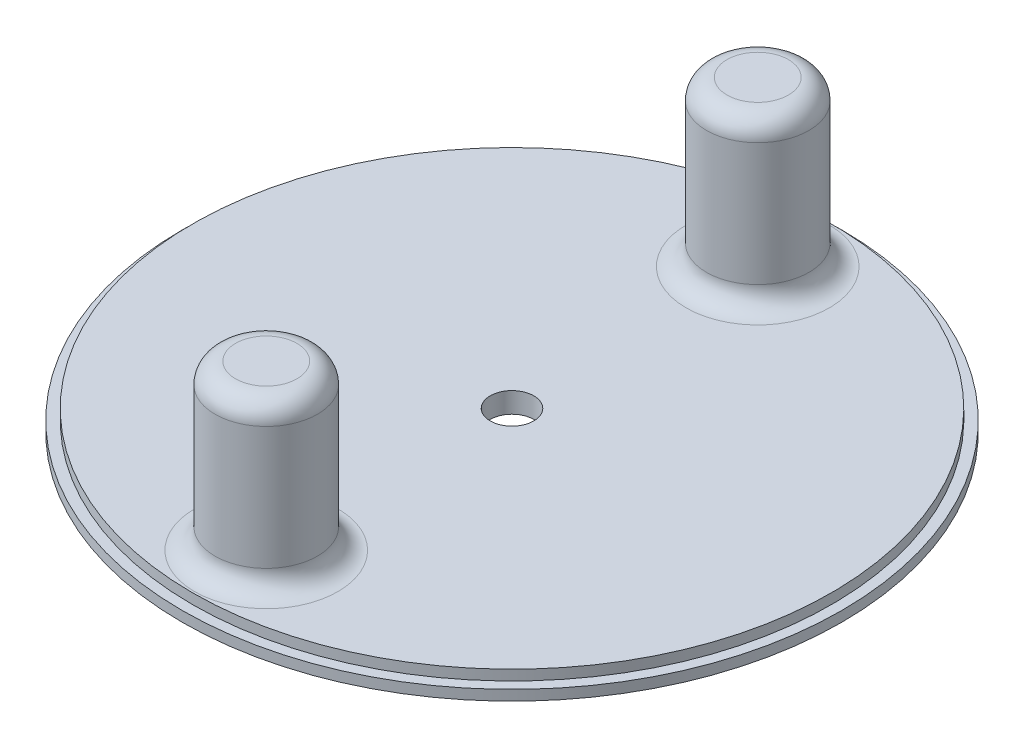
ISO-10303-21;
HEADER;
FILE_DESCRIPTION(('STEP AP214'),'2;1');
FILE_NAME('part.step','',(''),(''),'','','');
FILE_SCHEMA(('AUTOMOTIVE_DESIGN { 1 0 10303 214 1 1 1 1 }'));
ENDSEC;
DATA;
#1=APPLICATION_CONTEXT('core data for automotive mechanical design processes');
#2=APPLICATION_PROTOCOL_DEFINITION('international standard','automotive_design',2000,#1);
#3=PRODUCT_CONTEXT('',#1,'mechanical');
#4=PRODUCT('Part','Part','',(#3));
#5=PRODUCT_RELATED_PRODUCT_CATEGORY('part','',(#4));
#6=PRODUCT_DEFINITION_FORMATION('','',#4);
#7=PRODUCT_DEFINITION_CONTEXT('part definition',#1,'design');
#8=PRODUCT_DEFINITION('design','',#6,#7);
#9=PRODUCT_DEFINITION_SHAPE('','',#8);
#10=(LENGTH_UNIT() NAMED_UNIT(*) SI_UNIT(.MILLI.,.METRE.));
#11=(NAMED_UNIT(*) PLANE_ANGLE_UNIT() SI_UNIT($,.RADIAN.));
#12=(NAMED_UNIT(*) SI_UNIT($,.STERADIAN.) SOLID_ANGLE_UNIT());
#13=UNCERTAINTY_MEASURE_WITH_UNIT(LENGTH_MEASURE(1.E-05),#10,'distance_accuracy_value','');
#14=(GEOMETRIC_REPRESENTATION_CONTEXT(3) GLOBAL_UNCERTAINTY_ASSIGNED_CONTEXT((#13)) GLOBAL_UNIT_ASSIGNED_CONTEXT((#10,
#11,#12)) REPRESENTATION_CONTEXT('',''));
#15=CARTESIAN_POINT('',(0.,0.,0.));
#16=DIRECTION('',(0.,0.,1.));
#17=DIRECTION('',(1.,0.,0.));
#18=AXIS2_PLACEMENT_3D('',#15,#16,#17);
#19=CARTESIAN_POINT('',(0.,3.175,0.));
#20=DIRECTION('',(0.,1.,0.));
#21=DIRECTION('',(0.,0.,1.));
#22=AXIS2_PLACEMENT_3D('',#19,#20,#21);
#23=PLANE('',#22);
#24=CARTESIAN_POINT('',(0.,3.175,-38.1));
#25=DIRECTION('',(0.,1.,0.));
#26=DIRECTION('',(0.,0.,1.));
#27=AXIS2_PLACEMENT_3D('',#24,#25,#26);
#28=CIRCLE('',#27,11.1125);
#29=CARTESIAN_POINT('',(0.,3.175,-26.9875));
#30=VERTEX_POINT('',#29);
#31=EDGE_CURVE('E10',#30,#30,#28,.F.);
#32=ORIENTED_EDGE('',*,*,#31,.T.);
#33=EDGE_LOOP('',(#32));
#34=FACE_BOUND('',#33,.T.);
#35=CARTESIAN_POINT('',(0.,3.175,38.1));
#36=DIRECTION('',(0.,1.,0.));
#37=DIRECTION('',(0.,0.,1.));
#38=AXIS2_PLACEMENT_3D('',#35,#36,#37);
#39=CIRCLE('',#38,11.1125);
#40=CARTESIAN_POINT('',(0.,3.175,49.2125));
#41=VERTEX_POINT('',#40);
#42=EDGE_CURVE('E47',#41,#41,#39,.F.);
#43=ORIENTED_EDGE('',*,*,#42,.T.);
#44=EDGE_LOOP('',(#43));
#45=FACE_BOUND('',#44,.T.);
#46=CARTESIAN_POINT('',(0.,3.175,0.));
#47=DIRECTION('',(0.,1.,0.));
#48=DIRECTION('',(0.,0.,1.));
#49=AXIS2_PLACEMENT_3D('',#46,#47,#48);
#50=CIRCLE('',#49,3.3782);
#51=CARTESIAN_POINT('',(0.,3.175,3.3782));
#52=VERTEX_POINT('',#51);
#53=EDGE_CURVE('E105',#52,#52,#50,.T.);
#54=ORIENTED_EDGE('',*,*,#53,.F.);
#55=EDGE_LOOP('',(#54));
#56=FACE_BOUND('',#55,.T.);
#57=CARTESIAN_POINT('',(0.,3.175,0.));
#58=DIRECTION('',(0.,1.,0.));
#59=DIRECTION('',(0.,0.,1.));
#60=AXIS2_PLACEMENT_3D('',#57,#58,#59);
#61=CIRCLE('',#60,49.53);
#62=CARTESIAN_POINT('',(0.,3.175,49.53));
#63=VERTEX_POINT('',#62);
#64=EDGE_CURVE('E94',#63,#63,#61,.T.);
#65=ORIENTED_EDGE('',*,*,#64,.T.);
#66=EDGE_LOOP('',(#65));
#67=FACE_BOUND('',#66,.T.);
#68=ADVANCED_FACE('F39',(#34,#45,#56,#67),#23,.T.);
#69=CARTESIAN_POINT('',(0.,1.5875,0.));
#70=DIRECTION('',(0.,1.,0.));
#71=DIRECTION('',(0.,0.,1.));
#72=AXIS2_PLACEMENT_3D('',#69,#70,#71);
#73=PLANE('',#72);
#74=CARTESIAN_POINT('',(0.,1.5875,0.));
#75=DIRECTION('',(0.,1.,0.));
#76=DIRECTION('',(0.,0.,1.));
#77=AXIS2_PLACEMENT_3D('',#74,#75,#76);
#78=CIRCLE('',#77,51.1175);
#79=CARTESIAN_POINT('',(0.,1.5875,51.1175));
#80=VERTEX_POINT('',#79);
#81=EDGE_CURVE('E90',#80,#80,#78,.T.);
#82=ORIENTED_EDGE('',*,*,#81,.T.);
#83=EDGE_LOOP('',(#82));
#84=FACE_BOUND('',#83,.T.);
#85=CARTESIAN_POINT('',(0.,1.5875,0.));
#86=DIRECTION('',(0.,1.,0.));
#87=DIRECTION('',(0.,0.,1.));
#88=AXIS2_PLACEMENT_3D('',#85,#86,#87);
#89=CIRCLE('',#88,49.53);
#90=CARTESIAN_POINT('',(0.,1.5875,49.53));
#91=VERTEX_POINT('',#90);
#92=EDGE_CURVE('E97',#91,#91,#89,.T.);
#93=ORIENTED_EDGE('',*,*,#92,.F.);
#94=EDGE_LOOP('',(#93));
#95=FACE_BOUND('',#94,.T.);
#96=ADVANCED_FACE('F137',(#84,#95),#73,.T.);
#97=CARTESIAN_POINT('',(0.,1.5875,0.));
#98=DIRECTION('',(0.,-1.,0.));
#99=DIRECTION('',(0.,0.,-1.));
#100=AXIS2_PLACEMENT_3D('',#97,#98,#99);
#101=CYLINDRICAL_SURFACE('',#100,51.1175);
#102=ORIENTED_EDGE('',*,*,#81,.F.);
#103=EDGE_LOOP('',(#102));
#104=FACE_BOUND('',#103,.T.);
#105=CARTESIAN_POINT('',(0.,0.,0.));
#106=DIRECTION('',(0.,1.,0.));
#107=DIRECTION('',(0.,0.,1.));
#108=AXIS2_PLACEMENT_3D('',#105,#106,#107);
#109=CIRCLE('',#108,51.1175);
#110=CARTESIAN_POINT('',(0.,0.,51.1175));
#111=VERTEX_POINT('',#110);
#112=EDGE_CURVE('E91',#111,#111,#109,.T.);
#113=ORIENTED_EDGE('',*,*,#112,.T.);
#114=EDGE_LOOP('',(#113));
#115=FACE_BOUND('',#114,.T.);
#116=ADVANCED_FACE('F142',(#104,#115),#101,.T.);
#117=CARTESIAN_POINT('',(0.,0.,0.));
#118=DIRECTION('',(0.,1.,0.));
#119=DIRECTION('',(0.,0.,1.));
#120=AXIS2_PLACEMENT_3D('',#117,#118,#119);
#121=PLANE('',#120);
#122=CARTESIAN_POINT('',(0.,0.,-38.1));
#123=DIRECTION('',(0.,1.,0.));
#124=DIRECTION('',(0.,0.,1.));
#125=AXIS2_PLACEMENT_3D('',#122,#123,#124);
#126=CIRCLE('',#125,6.35);
#127=CARTESIAN_POINT('',(0.,0.,-31.75));
#128=VERTEX_POINT('',#127);
#129=EDGE_CURVE('E112',#128,#128,#126,.T.);
#130=ORIENTED_EDGE('',*,*,#129,.T.);
#131=EDGE_LOOP('',(#130));
#132=FACE_BOUND('',#131,.T.);
#133=CARTESIAN_POINT('',(0.,0.,38.1));
#134=DIRECTION('',(0.,1.,0.));
#135=DIRECTION('',(0.,0.,1.));
#136=AXIS2_PLACEMENT_3D('',#133,#134,#135);
#137=CIRCLE('',#136,6.35);
#138=CARTESIAN_POINT('',(0.,0.,44.45));
#139=VERTEX_POINT('',#138);
#140=EDGE_CURVE('E109',#139,#139,#137,.T.);
#141=ORIENTED_EDGE('',*,*,#140,.T.);
#142=EDGE_LOOP('',(#141));
#143=FACE_BOUND('',#142,.T.);
#144=CARTESIAN_POINT('',(0.,0.,0.));
#145=DIRECTION('',(0.,1.,0.));
#146=DIRECTION('',(0.,0.,1.));
#147=AXIS2_PLACEMENT_3D('',#144,#145,#146);
#148=CIRCLE('',#147,3.3782);
#149=CARTESIAN_POINT('',(0.,0.,3.3782));
#150=VERTEX_POINT('',#149);
#151=EDGE_CURVE('E100',#150,#150,#148,.T.);
#152=ORIENTED_EDGE('',*,*,#151,.T.);
#153=EDGE_LOOP('',(#152));
#154=FACE_BOUND('',#153,.T.);
#155=ORIENTED_EDGE('',*,*,#112,.F.);
#156=EDGE_LOOP('',(#155));
#157=FACE_BOUND('',#156,.T.);
#158=ADVANCED_FACE('F117',(#132,#143,#154,#157),#121,.F.);
#159=CARTESIAN_POINT('',(0.,3.175,0.));
#160=DIRECTION('',(0.,-1.,0.));
#161=DIRECTION('',(0.,0.,-1.));
#162=AXIS2_PLACEMENT_3D('',#159,#160,#161);
#163=CYLINDRICAL_SURFACE('',#162,49.53);
#164=ORIENTED_EDGE('',*,*,#64,.F.);
#165=EDGE_LOOP('',(#164));
#166=FACE_BOUND('',#165,.T.);
#167=ORIENTED_EDGE('',*,*,#92,.T.);
#168=EDGE_LOOP('',(#167));
#169=FACE_BOUND('',#168,.T.);
#170=ADVANCED_FACE('F149',(#166,#169),#163,.T.);
#171=CARTESIAN_POINT('',(0.,3.175,0.));
#172=DIRECTION('',(0.,1.,0.));
#173=DIRECTION('',(0.,0.,1.));
#174=AXIS2_PLACEMENT_3D('',#171,#172,#173);
#175=CYLINDRICAL_SURFACE('',#174,3.3782);
#176=ORIENTED_EDGE('',*,*,#53,.T.);
#177=EDGE_LOOP('',(#176));
#178=FACE_BOUND('',#177,.T.);
#179=ORIENTED_EDGE('',*,*,#151,.F.);
#180=EDGE_LOOP('',(#179));
#181=FACE_BOUND('',#180,.T.);
#182=ADVANCED_FACE('F147',(#178,#181),#175,.F.);
#183=CARTESIAN_POINT('',(0.,28.575,-38.1));
#184=DIRECTION('',(0.,-1.,0.));
#185=DIRECTION('',(0.,0.,-1.));
#186=AXIS2_PLACEMENT_3D('',#183,#184,#185);
#187=CYLINDRICAL_SURFACE('',#186,7.9375);
#188=CARTESIAN_POINT('',(0.,25.4,-38.1));
#189=DIRECTION('',(0.,1.,0.));
#190=DIRECTION('',(0.,0.,1.));
#191=AXIS2_PLACEMENT_3D('',#188,#189,#190);
#192=CIRCLE('',#191,7.9375);
#193=CARTESIAN_POINT('',(0.,25.4,-30.1625));
#194=VERTEX_POINT('',#193);
#195=EDGE_CURVE('E79',#194,#194,#192,.F.);
#196=ORIENTED_EDGE('',*,*,#195,.T.);
#197=EDGE_LOOP('',(#196));
#198=FACE_BOUND('',#197,.T.);
#199=CARTESIAN_POINT('',(0.,6.35,-38.1));
#200=DIRECTION('',(0.,1.,0.));
#201=DIRECTION('',(0.,0.,1.));
#202=AXIS2_PLACEMENT_3D('',#199,#200,#201);
#203=CIRCLE('',#202,7.9375);
#204=CARTESIAN_POINT('',(0.,6.35,-30.1625));
#205=VERTEX_POINT('',#204);
#206=EDGE_CURVE('E83',#205,#205,#203,.T.);
#207=ORIENTED_EDGE('',*,*,#206,.T.);
#208=EDGE_LOOP('',(#207));
#209=FACE_BOUND('',#208,.T.);
#210=ADVANCED_FACE('F182',(#198,#209),#187,.T.);
#211=CARTESIAN_POINT('',(0.,28.575,-38.1));
#212=DIRECTION('',(0.,1.,0.));
#213=DIRECTION('',(0.,0.,1.));
#214=AXIS2_PLACEMENT_3D('',#211,#212,#213);
#215=PLANE('',#214);
#216=CARTESIAN_POINT('',(0.,28.575,-38.1));
#217=DIRECTION('',(0.,1.,0.));
#218=DIRECTION('',(0.,0.,1.));
#219=AXIS2_PLACEMENT_3D('',#216,#217,#218);
#220=CIRCLE('',#219,4.7625);
#221=CARTESIAN_POINT('',(0.,28.575,-33.3375));
#222=VERTEX_POINT('',#221);
#223=EDGE_CURVE('E86',#222,#222,#220,.T.);
#224=ORIENTED_EDGE('',*,*,#223,.T.);
#225=EDGE_LOOP('',(#224));
#226=FACE_BOUND('',#225,.T.);
#227=ADVANCED_FACE('F184',(#226),#215,.T.);
#228=CARTESIAN_POINT('',(0.,28.575,38.1));
#229=DIRECTION('',(0.,-1.,0.));
#230=DIRECTION('',(0.,0.,-1.));
#231=AXIS2_PLACEMENT_3D('',#228,#229,#230);
#232=CYLINDRICAL_SURFACE('',#231,7.9375);
#233=CARTESIAN_POINT('',(0.,25.4,38.1));
#234=DIRECTION('',(0.,1.,0.));
#235=DIRECTION('',(0.,0.,1.));
#236=AXIS2_PLACEMENT_3D('',#233,#234,#235);
#237=CIRCLE('',#236,7.9375);
#238=CARTESIAN_POINT('',(0.,25.4,46.0375));
#239=VERTEX_POINT('',#238);
#240=EDGE_CURVE('E70',#239,#239,#237,.F.);
#241=ORIENTED_EDGE('',*,*,#240,.T.);
#242=EDGE_LOOP('',(#241));
#243=FACE_BOUND('',#242,.T.);
#244=CARTESIAN_POINT('',(0.,6.35,38.1));
#245=DIRECTION('',(0.,1.,0.));
#246=DIRECTION('',(0.,0.,1.));
#247=AXIS2_PLACEMENT_3D('',#244,#245,#246);
#248=CIRCLE('',#247,7.9375);
#249=CARTESIAN_POINT('',(0.,6.35,46.0375));
#250=VERTEX_POINT('',#249);
#251=EDGE_CURVE('E73',#250,#250,#248,.T.);
#252=ORIENTED_EDGE('',*,*,#251,.T.);
#253=EDGE_LOOP('',(#252));
#254=FACE_BOUND('',#253,.T.);
#255=ADVANCED_FACE('F190',(#243,#254),#232,.T.);
#256=CARTESIAN_POINT('',(0.,28.575,38.1));
#257=DIRECTION('',(0.,1.,0.));
#258=DIRECTION('',(0.,0.,1.));
#259=AXIS2_PLACEMENT_3D('',#256,#257,#258);
#260=PLANE('',#259);
#261=CARTESIAN_POINT('',(0.,28.575,38.1));
#262=DIRECTION('',(0.,1.,0.));
#263=DIRECTION('',(0.,0.,1.));
#264=AXIS2_PLACEMENT_3D('',#261,#262,#263);
#265=CIRCLE('',#264,4.7625);
#266=CARTESIAN_POINT('',(0.,28.575,42.8625));
#267=VERTEX_POINT('',#266);
#268=EDGE_CURVE('E76',#267,#267,#265,.T.);
#269=ORIENTED_EDGE('',*,*,#268,.T.);
#270=EDGE_LOOP('',(#269));
#271=FACE_BOUND('',#270,.T.);
#272=ADVANCED_FACE('F197',(#271),#260,.T.);
#273=CARTESIAN_POINT('',(0.,0.,38.1));
#274=DIRECTION('',(0.,1.,0.));
#275=DIRECTION('',(0.,0.,1.));
#276=AXIS2_PLACEMENT_3D('',#273,#274,#275);
#277=CYLINDRICAL_SURFACE('',#276,6.35);
#278=CARTESIAN_POINT('',(0.,23.8125,38.1));
#279=DIRECTION('',(0.,1.,0.));
#280=DIRECTION('',(0.,0.,1.));
#281=AXIS2_PLACEMENT_3D('',#278,#279,#280);
#282=CIRCLE('',#281,6.35);
#283=CARTESIAN_POINT('',(0.,23.8125,44.45));
#284=VERTEX_POINT('',#283);
#285=EDGE_CURVE('E57',#284,#284,#282,.T.);
#286=ORIENTED_EDGE('',*,*,#285,.T.);
#287=EDGE_LOOP('',(#286));
#288=FACE_BOUND('',#287,.T.);
#289=ORIENTED_EDGE('',*,*,#140,.F.);
#290=EDGE_LOOP('',(#289));
#291=FACE_BOUND('',#290,.T.);
#292=ADVANCED_FACE('F133',(#288,#291),#277,.F.);
#293=CARTESIAN_POINT('',(0.,26.9875,38.1));
#294=DIRECTION('',(0.,1.,0.));
#295=DIRECTION('',(0.,0.,1.));
#296=AXIS2_PLACEMENT_3D('',#293,#294,#295);
#297=PLANE('',#296);
#298=CARTESIAN_POINT('',(0.,26.9875,38.1));
#299=DIRECTION('',(0.,1.,0.));
#300=DIRECTION('',(0.,0.,1.));
#301=AXIS2_PLACEMENT_3D('',#298,#299,#300);
#302=CIRCLE('',#301,3.175);
#303=CARTESIAN_POINT('',(0.,26.9875,41.275));
#304=VERTEX_POINT('',#303);
#305=EDGE_CURVE('E53',#304,#304,#302,.F.);
#306=ORIENTED_EDGE('',*,*,#305,.T.);
#307=EDGE_LOOP('',(#306));
#308=FACE_BOUND('',#307,.T.);
#309=ADVANCED_FACE('F123',(#308),#297,.F.);
#310=CARTESIAN_POINT('',(0.,0.,-38.1));
#311=DIRECTION('',(0.,1.,0.));
#312=DIRECTION('',(0.,0.,1.));
#313=AXIS2_PLACEMENT_3D('',#310,#311,#312);
#314=CYLINDRICAL_SURFACE('',#313,6.35);
#315=CARTESIAN_POINT('',(0.,23.8125,-38.1));
#316=DIRECTION('',(0.,1.,0.));
#317=DIRECTION('',(0.,0.,1.));
#318=AXIS2_PLACEMENT_3D('',#315,#316,#317);
#319=CIRCLE('',#318,6.35);
#320=CARTESIAN_POINT('',(0.,23.8125,-31.75));
#321=VERTEX_POINT('',#320);
#322=EDGE_CURVE('E66',#321,#321,#319,.T.);
#323=ORIENTED_EDGE('',*,*,#322,.T.);
#324=EDGE_LOOP('',(#323));
#325=FACE_BOUND('',#324,.T.);
#326=ORIENTED_EDGE('',*,*,#129,.F.);
#327=EDGE_LOOP('',(#326));
#328=FACE_BOUND('',#327,.T.);
#329=ADVANCED_FACE('F120',(#325,#328),#314,.F.);
#330=CARTESIAN_POINT('',(0.,26.9875,-38.1));
#331=DIRECTION('',(0.,1.,0.));
#332=DIRECTION('',(0.,0.,1.));
#333=AXIS2_PLACEMENT_3D('',#330,#331,#332);
#334=PLANE('',#333);
#335=CARTESIAN_POINT('',(0.,26.9875,-38.1));
#336=DIRECTION('',(0.,1.,0.));
#337=DIRECTION('',(0.,0.,1.));
#338=AXIS2_PLACEMENT_3D('',#335,#336,#337);
#339=CIRCLE('',#338,3.175);
#340=CARTESIAN_POINT('',(0.,26.9875,-34.925));
#341=VERTEX_POINT('',#340);
#342=EDGE_CURVE('E62',#341,#341,#339,.F.);
#343=ORIENTED_EDGE('',*,*,#342,.T.);
#344=EDGE_LOOP('',(#343));
#345=FACE_BOUND('',#344,.T.);
#346=ADVANCED_FACE('F122',(#345),#334,.F.);
#347=CARTESIAN_POINT('',(0.,25.4,-38.1));
#348=DIRECTION('',(0.,1.,0.));
#349=DIRECTION('',(0.,0.,1.));
#350=AXIS2_PLACEMENT_3D('',#347,#348,#349);
#351=TOROIDAL_SURFACE('',#350,4.7625,3.175);
#352=ORIENTED_EDGE('',*,*,#195,.F.);
#353=EDGE_LOOP('',(#352));
#354=FACE_BOUND('',#353,.T.);
#355=ORIENTED_EDGE('',*,*,#223,.F.);
#356=EDGE_LOOP('',(#355));
#357=FACE_BOUND('',#356,.T.);
#358=ADVANCED_FACE('F130',(#354,#357),#351,.T.);
#359=CARTESIAN_POINT('',(0.,25.4,38.1));
#360=DIRECTION('',(0.,1.,0.));
#361=DIRECTION('',(0.,0.,1.));
#362=AXIS2_PLACEMENT_3D('',#359,#360,#361);
#363=TOROIDAL_SURFACE('',#362,4.7625,3.175);
#364=ORIENTED_EDGE('',*,*,#240,.F.);
#365=EDGE_LOOP('',(#364));
#366=FACE_BOUND('',#365,.T.);
#367=ORIENTED_EDGE('',*,*,#268,.F.);
#368=EDGE_LOOP('',(#367));
#369=FACE_BOUND('',#368,.T.);
#370=ADVANCED_FACE('F160',(#366,#369),#363,.T.);
#371=CARTESIAN_POINT('',(0.,23.8125,-38.1));
#372=DIRECTION('',(0.,1.,0.));
#373=DIRECTION('',(0.,0.,1.));
#374=AXIS2_PLACEMENT_3D('',#371,#372,#373);
#375=DEGENERATE_TOROIDAL_SURFACE('',#374,3.175,3.175,.T.);
#376=ORIENTED_EDGE('',*,*,#342,.F.);
#377=EDGE_LOOP('',(#376));
#378=FACE_BOUND('',#377,.T.);
#379=ORIENTED_EDGE('',*,*,#322,.F.);
#380=EDGE_LOOP('',(#379));
#381=FACE_BOUND('',#380,.T.);
#382=ADVANCED_FACE('F164',(#378,#381),#375,.F.);
#383=CARTESIAN_POINT('',(0.,23.8125,38.1));
#384=DIRECTION('',(0.,1.,0.));
#385=DIRECTION('',(0.,0.,1.));
#386=AXIS2_PLACEMENT_3D('',#383,#384,#385);
#387=DEGENERATE_TOROIDAL_SURFACE('',#386,3.175,3.175,.T.);
#388=ORIENTED_EDGE('',*,*,#305,.F.);
#389=EDGE_LOOP('',(#388));
#390=FACE_BOUND('',#389,.T.);
#391=ORIENTED_EDGE('',*,*,#285,.F.);
#392=EDGE_LOOP('',(#391));
#393=FACE_BOUND('',#392,.T.);
#394=ADVANCED_FACE('F168',(#390,#393),#387,.F.);
#395=CARTESIAN_POINT('',(0.,6.35,-38.1));
#396=DIRECTION('',(0.,1.,0.));
#397=DIRECTION('',(0.,0.,1.));
#398=AXIS2_PLACEMENT_3D('',#395,#396,#397);
#399=TOROIDAL_SURFACE('',#398,11.1125,3.175);
#400=ORIENTED_EDGE('',*,*,#31,.F.);
#401=EDGE_LOOP('',(#400));
#402=FACE_BOUND('',#401,.T.);
#403=ORIENTED_EDGE('',*,*,#206,.F.);
#404=EDGE_LOOP('',(#403));
#405=FACE_BOUND('',#404,.T.);
#406=ADVANCED_FACE('F171',(#402,#405),#399,.F.);
#407=CARTESIAN_POINT('',(0.,6.35,38.1));
#408=DIRECTION('',(0.,1.,0.));
#409=DIRECTION('',(0.,0.,1.));
#410=AXIS2_PLACEMENT_3D('',#407,#408,#409);
#411=TOROIDAL_SURFACE('',#410,11.1125,3.175);
#412=ORIENTED_EDGE('',*,*,#42,.F.);
#413=EDGE_LOOP('',(#412));
#414=FACE_BOUND('',#413,.T.);
#415=ORIENTED_EDGE('',*,*,#251,.F.);
#416=EDGE_LOOP('',(#415));
#417=FACE_BOUND('',#416,.T.);
#418=ADVANCED_FACE('F41',(#414,#417),#411,.F.);
#419=CLOSED_SHELL('',(#68,#96,#116,#158,#170,#182,#210,#227,#255,#272,#292,#309,#329,#346,#358,
#370,#382,#394,#406,#418));
#420=MANIFOLD_SOLID_BREP('B2',#419);
#421=ADVANCED_BREP_SHAPE_REPRESENTATION('',(#18,#420),#14);
#422=SHAPE_DEFINITION_REPRESENTATION(#9,#421);
ENDSEC;
END-ISO-10303-21;
